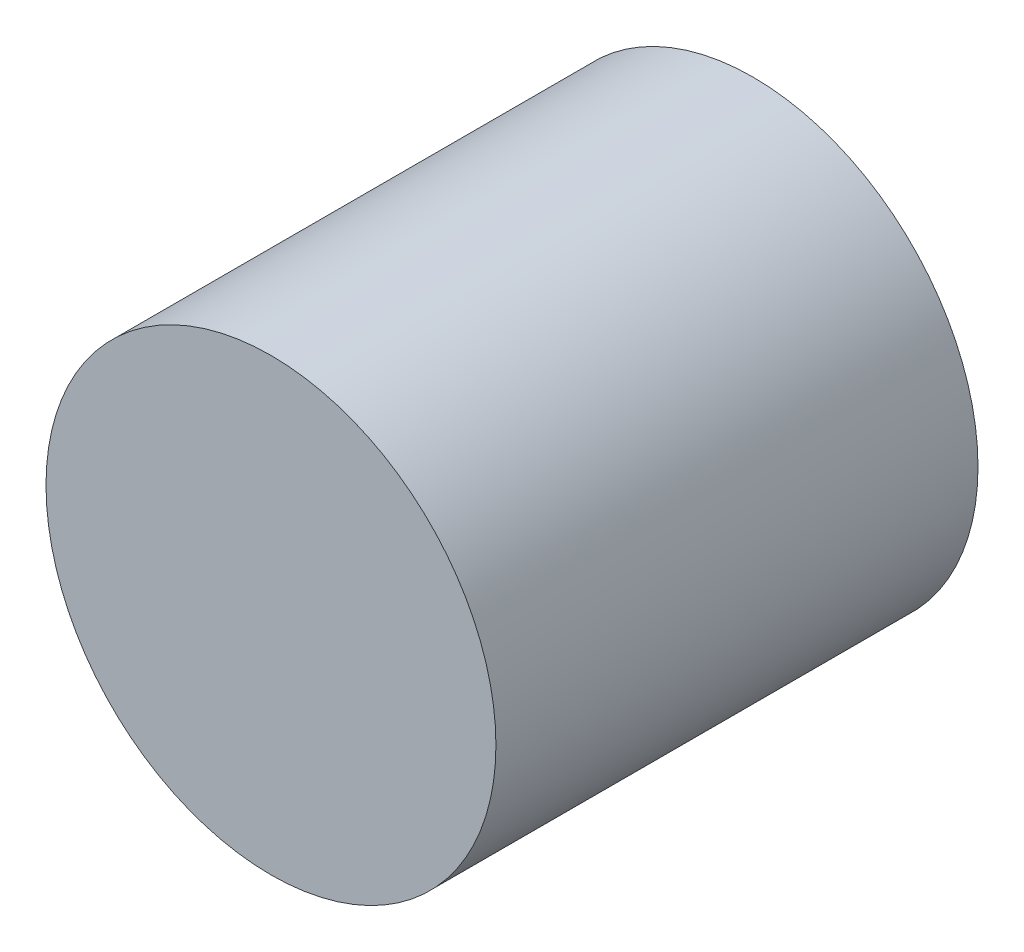
ISO-10303-21;
HEADER;
FILE_DESCRIPTION(('STEP AP214'),'2;1');
FILE_NAME('part.step','',(''),(''),'','','');
FILE_SCHEMA(('AUTOMOTIVE_DESIGN { 1 0 10303 214 1 1 1 1 }'));
ENDSEC;
DATA;
#1=APPLICATION_CONTEXT('core data for automotive mechanical design processes');
#2=APPLICATION_PROTOCOL_DEFINITION('international standard','automotive_design',2000,#1);
#3=PRODUCT_CONTEXT('',#1,'mechanical');
#4=PRODUCT('Part','Part','',(#3));
#5=PRODUCT_RELATED_PRODUCT_CATEGORY('part','',(#4));
#6=PRODUCT_DEFINITION_FORMATION('','',#4);
#7=PRODUCT_DEFINITION_CONTEXT('part definition',#1,'design');
#8=PRODUCT_DEFINITION('design','',#6,#7);
#9=PRODUCT_DEFINITION_SHAPE('','',#8);
#10=(LENGTH_UNIT() NAMED_UNIT(*) SI_UNIT(.MILLI.,.METRE.));
#11=(NAMED_UNIT(*) PLANE_ANGLE_UNIT() SI_UNIT($,.RADIAN.));
#12=(NAMED_UNIT(*) SI_UNIT($,.STERADIAN.) SOLID_ANGLE_UNIT());
#13=UNCERTAINTY_MEASURE_WITH_UNIT(LENGTH_MEASURE(1.E-05),#10,'distance_accuracy_value','');
#14=(GEOMETRIC_REPRESENTATION_CONTEXT(3) GLOBAL_UNCERTAINTY_ASSIGNED_CONTEXT((#13)) GLOBAL_UNIT_ASSIGNED_CONTEXT((#10,
#11,#12)) REPRESENTATION_CONTEXT('',''));
#15=CARTESIAN_POINT('',(0.,0.,0.));
#16=DIRECTION('',(0.,0.,1.));
#17=DIRECTION('',(1.,0.,0.));
#18=AXIS2_PLACEMENT_3D('',#15,#16,#17);
#19=CARTESIAN_POINT('',(0.,0.,30.));
#20=DIRECTION('',(0.,0.,-1.));
#21=DIRECTION('',(-1.,0.,0.));
#22=AXIS2_PLACEMENT_3D('',#19,#20,#21);
#23=CYLINDRICAL_SURFACE('',#22,14.);
#24=CARTESIAN_POINT('',(0.,0.,30.));
#25=DIRECTION('',(0.,0.,1.));
#26=DIRECTION('',(1.,0.,0.));
#27=AXIS2_PLACEMENT_3D('',#24,#25,#26);
#28=CIRCLE('',#27,14.);
#29=CARTESIAN_POINT('',(14.,0.,30.));
#30=VERTEX_POINT('',#29);
#31=EDGE_CURVE('E10',#30,#30,#28,.T.);
#32=ORIENTED_EDGE('',*,*,#31,.F.);
#33=EDGE_LOOP('',(#32));
#34=FACE_BOUND('',#33,.T.);
#35=CARTESIAN_POINT('',(0.,0.,0.));
#36=DIRECTION('',(0.,0.,1.));
#37=DIRECTION('',(1.,0.,0.));
#38=AXIS2_PLACEMENT_3D('',#35,#36,#37);
#39=CIRCLE('',#38,14.);
#40=CARTESIAN_POINT('',(14.,0.,0.));
#41=VERTEX_POINT('',#40);
#42=EDGE_CURVE('E42',#41,#41,#39,.T.);
#43=ORIENTED_EDGE('',*,*,#42,.T.);
#44=EDGE_LOOP('',(#43));
#45=FACE_BOUND('',#44,.T.);
#46=ADVANCED_FACE('F39',(#34,#45),#23,.T.);
#47=CARTESIAN_POINT('',(0.,0.,30.));
#48=DIRECTION('',(0.,0.,1.));
#49=DIRECTION('',(1.,0.,0.));
#50=AXIS2_PLACEMENT_3D('',#47,#48,#49);
#51=PLANE('',#50);
#52=ORIENTED_EDGE('',*,*,#31,.T.);
#53=EDGE_LOOP('',(#52));
#54=FACE_BOUND('',#53,.T.);
#55=ADVANCED_FACE('F54',(#54),#51,.T.);
#56=CARTESIAN_POINT('',(0.,0.,0.));
#57=DIRECTION('',(0.,0.,1.));
#58=DIRECTION('',(1.,0.,0.));
#59=AXIS2_PLACEMENT_3D('',#56,#57,#58);
#60=PLANE('',#59);
#61=ORIENTED_EDGE('',*,*,#42,.F.);
#62=EDGE_LOOP('',(#61));
#63=FACE_BOUND('',#62,.T.);
#64=ADVANCED_FACE('F52',(#63),#60,.F.);
#65=CLOSED_SHELL('',(#46,#55,#64));
#66=MANIFOLD_SOLID_BREP('B2',#65);
#67=ADVANCED_BREP_SHAPE_REPRESENTATION('',(#18,#66),#14);
#68=SHAPE_DEFINITION_REPRESENTATION(#9,#67);
ENDSEC;
END-ISO-10303-21;
